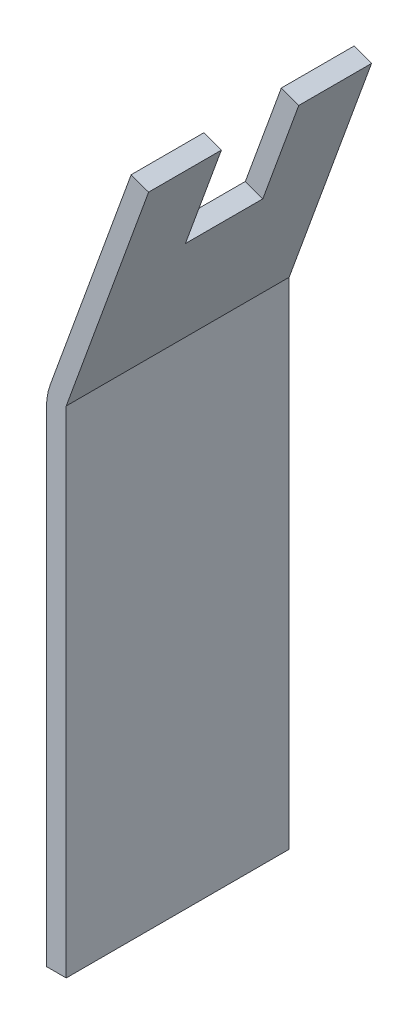
ISO-10303-21;
HEADER;
FILE_DESCRIPTION(('STEP AP214'),'2;1');
FILE_NAME('part.step','',(''),(''),'','','');
FILE_SCHEMA(('AUTOMOTIVE_DESIGN { 1 0 10303 214 1 1 1 1 }'));
ENDSEC;
DATA;
#1=APPLICATION_CONTEXT('core data for automotive mechanical design processes');
#2=APPLICATION_PROTOCOL_DEFINITION('international standard','automotive_design',2000,#1);
#3=PRODUCT_CONTEXT('',#1,'mechanical');
#4=PRODUCT('Part','Part','',(#3));
#5=PRODUCT_RELATED_PRODUCT_CATEGORY('part','',(#4));
#6=PRODUCT_DEFINITION_FORMATION('','',#4);
#7=PRODUCT_DEFINITION_CONTEXT('part definition',#1,'design');
#8=PRODUCT_DEFINITION('design','',#6,#7);
#9=PRODUCT_DEFINITION_SHAPE('','',#8);
#10=(LENGTH_UNIT() NAMED_UNIT(*) SI_UNIT(.MILLI.,.METRE.));
#11=(NAMED_UNIT(*) PLANE_ANGLE_UNIT() SI_UNIT($,.RADIAN.));
#12=(NAMED_UNIT(*) SI_UNIT($,.STERADIAN.) SOLID_ANGLE_UNIT());
#13=UNCERTAINTY_MEASURE_WITH_UNIT(LENGTH_MEASURE(1.E-05),#10,'distance_accuracy_value','');
#14=(GEOMETRIC_REPRESENTATION_CONTEXT(3) GLOBAL_UNCERTAINTY_ASSIGNED_CONTEXT((#13)) GLOBAL_UNIT_ASSIGNED_CONTEXT((#10,
#11,#12)) REPRESENTATION_CONTEXT('',''));
#15=CARTESIAN_POINT('',(0.,0.,0.));
#16=DIRECTION('',(0.,0.,1.));
#17=DIRECTION('',(1.,0.,0.));
#18=AXIS2_PLACEMENT_3D('',#15,#16,#17);
#19=CARTESIAN_POINT('',(13.6808057330267,117.587704831436,-18.));
#20=DIRECTION('',(0.342020143325668,0.939692620785909,0.));
#21=DIRECTION('',(-0.939692620785909,0.342020143325668,0.));
#22=AXIS2_PLACEMENT_3D('',#19,#20,#21);
#23=PLANE('',#22);
#24=DIRECTION('',(-0.939692620785909,0.342020143325666,0.));
#25=VECTOR('',#24,1.);
#26=CARTESIAN_POINT('',(36.3282885778676,109.34469519486,-6.25));
#27=LINE('',#26,#25);
#28=CARTESIAN_POINT('',(16.4998835953844,116.561644401459,-6.25));
#29=VERTEX_POINT('',#28);
#30=CARTESIAN_POINT('',(13.6808057330267,117.587704831436,-6.25));
#31=VERTEX_POINT('',#30);
#32=EDGE_CURVE('E149',#29,#31,#27,.T.);
#33=ORIENTED_EDGE('',*,*,#32,.F.);
#34=DIRECTION('',(0.,0.,1.));
#35=VECTOR('',#34,1.);
#36=CARTESIAN_POINT('',(16.4998835953844,116.561644401459,-18.));
#37=LINE('',#36,#35);
#38=CARTESIAN_POINT('',(16.4998835953844,116.561644401459,-18.));
#39=VERTEX_POINT('',#38);
#40=EDGE_CURVE('E138',#39,#29,#37,.T.);
#41=ORIENTED_EDGE('',*,*,#40,.F.);
#42=DIRECTION('',(-0.939692620785909,0.342020143325668,0.));
#43=VECTOR('',#42,1.);
#44=CARTESIAN_POINT('',(13.6808057330267,117.587704831436,-18.));
#45=LINE('',#44,#43);
#46=CARTESIAN_POINT('',(13.6808057330267,117.587704831436,-18.));
#47=VERTEX_POINT('',#46);
#48=EDGE_CURVE('E177',#39,#47,#45,.T.);
#49=ORIENTED_EDGE('',*,*,#48,.T.);
#50=DIRECTION('',(0.,0.,1.));
#51=VECTOR('',#50,1.);
#52=CARTESIAN_POINT('',(13.6808057330267,117.587704831436,-18.));
#53=LINE('',#52,#51);
#54=EDGE_CURVE('E190',#47,#31,#53,.T.);
#55=ORIENTED_EDGE('',*,*,#54,.T.);
#56=EDGE_LOOP('',(#33,#41,#49,#55));
#57=FACE_BOUND('',#56,.T.);
#58=ADVANCED_FACE('F35',(#57),#23,.T.);
#59=CARTESIAN_POINT('',(3.19253331742775,0.,-18.));
#60=DIRECTION('',(0.,-1.,0.));
#61=DIRECTION('',(1.,0.,0.));
#62=AXIS2_PLACEMENT_3D('',#59,#60,#61);
#63=PLANE('',#62);
#64=DIRECTION('',(0.,0.,1.));
#65=VECTOR('',#64,1.);
#66=CARTESIAN_POINT('',(3.19253331742775,0.,-18.));
#67=LINE('',#66,#65);
#68=CARTESIAN_POINT('',(3.19253331742775,0.,-18.));
#69=VERTEX_POINT('',#68);
#70=CARTESIAN_POINT('',(3.19253331742775,0.,18.));
#71=VERTEX_POINT('',#70);
#72=EDGE_CURVE('E185',#69,#71,#67,.T.);
#73=ORIENTED_EDGE('',*,*,#72,.T.);
#74=DIRECTION('',(1.,0.,0.));
#75=VECTOR('',#74,1.);
#76=CARTESIAN_POINT('',(3.19253331742775,0.,18.));
#77=LINE('',#76,#75);
#78=CARTESIAN_POINT('',(0.,0.,18.));
#79=VERTEX_POINT('',#78);
#80=EDGE_CURVE('E152',#79,#71,#77,.T.);
#81=ORIENTED_EDGE('',*,*,#80,.F.);
#82=DIRECTION('',(0.,0.,1.));
#83=VECTOR('',#82,1.);
#84=CARTESIAN_POINT('',(0.,0.,-18.));
#85=LINE('',#84,#83);
#86=CARTESIAN_POINT('',(0.,0.,-18.));
#87=VERTEX_POINT('',#86);
#88=EDGE_CURVE('E186',#87,#79,#85,.T.);
#89=ORIENTED_EDGE('',*,*,#88,.F.);
#90=DIRECTION('',(1.,0.,0.));
#91=VECTOR('',#90,1.);
#92=CARTESIAN_POINT('',(3.19253331742775,0.,-18.));
#93=LINE('',#92,#91);
#94=EDGE_CURVE('E169',#87,#69,#93,.T.);
#95=ORIENTED_EDGE('',*,*,#94,.T.);
#96=EDGE_LOOP('',(#73,#81,#89,#95));
#97=FACE_BOUND('',#96,.T.);
#98=ADVANCED_FACE('F227',(#97),#63,.T.);
#99=CARTESIAN_POINT('',(0.,0.,-18.));
#100=DIRECTION('',(-1.,0.,0.));
#101=DIRECTION('',(0.,0.,1.));
#102=AXIS2_PLACEMENT_3D('',#99,#100,#101);
#103=PLANE('',#102);
#104=DIRECTION('',(0.,-1.,0.));
#105=VECTOR('',#104,1.);
#106=CARTESIAN_POINT('',(0.,0.,18.));
#107=LINE('',#106,#105);
#108=CARTESIAN_POINT('',(0.,78.2367301929154,18.));
#109=VERTEX_POINT('',#108);
#110=EDGE_CURVE('E167',#109,#79,#107,.T.);
#111=ORIENTED_EDGE('',*,*,#110,.F.);
#112=DIRECTION('',(0.,0.,1.));
#113=VECTOR('',#112,1.);
#114=CARTESIAN_POINT('',(0.,78.2367301929154,-18.));
#115=LINE('',#114,#113);
#116=CARTESIAN_POINT('',(0.,78.2367301929154,-18.));
#117=VERTEX_POINT('',#116);
#118=EDGE_CURVE('E43',#109,#117,#115,.F.);
#119=ORIENTED_EDGE('',*,*,#118,.T.);
#120=DIRECTION('',(0.,-1.,0.));
#121=VECTOR('',#120,1.);
#122=CARTESIAN_POINT('',(0.,0.,-18.));
#123=LINE('',#122,#121);
#124=EDGE_CURVE('E183',#117,#87,#123,.T.);
#125=ORIENTED_EDGE('',*,*,#124,.T.);
#126=ORIENTED_EDGE('',*,*,#88,.T.);
#127=EDGE_LOOP('',(#111,#119,#125,#126));
#128=FACE_BOUND('',#127,.T.);
#129=ADVANCED_FACE('F207',(#128),#103,.T.);
#130=CARTESIAN_POINT('',(0.,80.,-18.));
#131=DIRECTION('',(-0.939692620785909,0.342020143325666,0.));
#132=DIRECTION('',(-0.342020143325666,-0.939692620785909,0.));
#133=AXIS2_PLACEMENT_3D('',#130,#131,#132);
#134=PLANE('',#133);
#135=DIRECTION('',(-0.342020143325666,-0.939692620785909,0.));
#136=VECTOR('',#135,1.);
#137=CARTESIAN_POINT('',(13.6808057330267,117.587704831436,-6.25));
#138=LINE('',#137,#136);
#139=CARTESIAN_POINT('',(7.86646329649034,101.612930278076,-6.25));
#140=VERTEX_POINT('',#139);
#141=EDGE_CURVE('E132',#31,#140,#138,.T.);
#142=ORIENTED_EDGE('',*,*,#141,.F.);
#143=ORIENTED_EDGE('',*,*,#54,.F.);
#144=DIRECTION('',(-0.342020143325666,-0.939692620785909,0.));
#145=VECTOR('',#144,1.);
#146=CARTESIAN_POINT('',(0.,80.,-18.));
#147=LINE('',#146,#145);
#148=CARTESIAN_POINT('',(0.603073792140909,81.656931626172,-18.));
#149=VERTEX_POINT('',#148);
#150=EDGE_CURVE('E180',#47,#149,#147,.T.);
#151=ORIENTED_EDGE('',*,*,#150,.T.);
#152=DIRECTION('',(0.,0.,1.));
#153=VECTOR('',#152,1.);
#154=CARTESIAN_POINT('',(0.603073792140909,81.656931626172,-18.));
#155=LINE('',#154,#153);
#156=CARTESIAN_POINT('',(0.603073792140909,81.656931626172,18.));
#157=VERTEX_POINT('',#156);
#158=EDGE_CURVE('E189',#149,#157,#155,.T.);
#159=ORIENTED_EDGE('',*,*,#158,.T.);
#160=DIRECTION('',(-0.342020143325666,-0.939692620785909,0.));
#161=VECTOR('',#160,1.);
#162=CARTESIAN_POINT('',(0.,80.,18.));
#163=LINE('',#162,#161);
#164=CARTESIAN_POINT('',(13.6808057330267,117.587704831436,18.));
#165=VERTEX_POINT('',#164);
#166=EDGE_CURVE('E164',#165,#157,#163,.T.);
#167=ORIENTED_EDGE('',*,*,#166,.F.);
#168=CARTESIAN_POINT('',(13.6808057330267,117.587704831436,6.25));
#169=VERTEX_POINT('',#168);
#170=EDGE_CURVE('E193',#169,#165,#53,.T.);
#171=ORIENTED_EDGE('',*,*,#170,.F.);
#172=DIRECTION('',(0.342020143325666,0.939692620785909,0.));
#173=VECTOR('',#172,1.);
#174=CARTESIAN_POINT('',(7.86646329649034,101.612930278076,6.25));
#175=LINE('',#174,#173);
#176=CARTESIAN_POINT('',(7.86646329649034,101.612930278076,6.25));
#177=VERTEX_POINT('',#176);
#178=EDGE_CURVE('E139',#177,#169,#175,.T.);
#179=ORIENTED_EDGE('',*,*,#178,.F.);
#180=DIRECTION('',(0.,0.,1.));
#181=VECTOR('',#180,1.);
#182=CARTESIAN_POINT('',(7.86646329649034,101.612930278076,-6.25));
#183=LINE('',#182,#181);
#184=EDGE_CURVE('E141',#140,#177,#183,.T.);
#185=ORIENTED_EDGE('',*,*,#184,.F.);
#186=EDGE_LOOP('',(#142,#143,#151,#159,#167,#171,#179,#185));
#187=FACE_BOUND('',#186,.T.);
#188=ADVANCED_FACE('F217',(#187),#134,.T.);
#189=DIRECTION('',(-0.939692620785909,0.342020143325666,0.));
#190=VECTOR('',#189,1.);
#191=CARTESIAN_POINT('',(36.3282885778676,109.34469519486,6.25));
#192=LINE('',#191,#190);
#193=CARTESIAN_POINT('',(16.4998835953844,116.561644401459,6.25));
#194=VERTEX_POINT('',#193);
#195=EDGE_CURVE('E50',#194,#169,#192,.T.);
#196=ORIENTED_EDGE('',*,*,#195,.T.);
#197=ORIENTED_EDGE('',*,*,#170,.T.);
#198=DIRECTION('',(-0.939692620785909,0.342020143325668,0.));
#199=VECTOR('',#198,1.);
#200=CARTESIAN_POINT('',(13.6808057330267,117.587704831436,18.));
#201=LINE('',#200,#199);
#202=CARTESIAN_POINT('',(16.4998835953844,116.561644401459,18.));
#203=VERTEX_POINT('',#202);
#204=EDGE_CURVE('E161',#203,#165,#201,.T.);
#205=ORIENTED_EDGE('',*,*,#204,.F.);
#206=EDGE_CURVE('E195',#194,#203,#37,.T.);
#207=ORIENTED_EDGE('',*,*,#206,.F.);
#208=EDGE_LOOP('',(#196,#197,#205,#207));
#209=FACE_BOUND('',#208,.T.);
#210=ADVANCED_FACE('F235',(#209),#23,.T.);
#211=CARTESIAN_POINT('',(16.4998835953844,116.561644401459,-18.));
#212=DIRECTION('',(0.939692620785909,-0.342020143325667,0.));
#213=DIRECTION('',(0.342020143325667,0.939692620785909,0.));
#214=AXIS2_PLACEMENT_3D('',#211,#212,#213);
#215=PLANE('',#214);
#216=DIRECTION('',(-0.342020143325667,-0.939692620785909,0.));
#217=VECTOR('',#216,1.);
#218=CARTESIAN_POINT('',(16.4998835953844,116.561644401459,-6.25));
#219=LINE('',#218,#217);
#220=CARTESIAN_POINT('',(10.6855411588481,100.586869848099,-6.25));
#221=VERTEX_POINT('',#220);
#222=EDGE_CURVE('E129',#29,#221,#219,.T.);
#223=ORIENTED_EDGE('',*,*,#222,.T.);
#224=DIRECTION('',(0.,0.,1.));
#225=VECTOR('',#224,1.);
#226=CARTESIAN_POINT('',(10.6855411588481,100.586869848099,-6.25));
#227=LINE('',#226,#225);
#228=CARTESIAN_POINT('',(10.6855411588481,100.586869848099,6.25));
#229=VERTEX_POINT('',#228);
#230=EDGE_CURVE('E117',#221,#229,#227,.T.);
#231=ORIENTED_EDGE('',*,*,#230,.T.);
#232=DIRECTION('',(0.342020143325667,0.939692620785909,0.));
#233=VECTOR('',#232,1.);
#234=CARTESIAN_POINT('',(10.6855411588481,100.586869848099,6.25));
#235=LINE('',#234,#233);
#236=EDGE_CURVE('E146',#229,#194,#235,.T.);
#237=ORIENTED_EDGE('',*,*,#236,.T.);
#238=ORIENTED_EDGE('',*,*,#206,.T.);
#239=DIRECTION('',(0.342020143325667,0.939692620785909,0.));
#240=VECTOR('',#239,1.);
#241=CARTESIAN_POINT('',(16.4998835953844,116.561644401459,18.));
#242=LINE('',#241,#240);
#243=CARTESIAN_POINT('',(3.19253331742773,80.,18.));
#244=VERTEX_POINT('',#243);
#245=EDGE_CURVE('E158',#244,#203,#242,.T.);
#246=ORIENTED_EDGE('',*,*,#245,.F.);
#247=DIRECTION('',(0.,0.,1.));
#248=VECTOR('',#247,1.);
#249=CARTESIAN_POINT('',(3.19253331742773,80.,-18.));
#250=LINE('',#249,#248);
#251=CARTESIAN_POINT('',(3.19253331742773,80.,-18.));
#252=VERTEX_POINT('',#251);
#253=EDGE_CURVE('E196',#252,#244,#250,.T.);
#254=ORIENTED_EDGE('',*,*,#253,.F.);
#255=DIRECTION('',(0.342020143325667,0.939692620785909,0.));
#256=VECTOR('',#255,1.);
#257=CARTESIAN_POINT('',(16.4998835953844,116.561644401459,-18.));
#258=LINE('',#257,#256);
#259=EDGE_CURVE('E175',#252,#39,#258,.T.);
#260=ORIENTED_EDGE('',*,*,#259,.T.);
#261=ORIENTED_EDGE('',*,*,#40,.T.);
#262=EDGE_LOOP('',(#223,#231,#237,#238,#246,#254,#260,#261));
#263=FACE_BOUND('',#262,.T.);
#264=ADVANCED_FACE('F136',(#263),#215,.T.);
#265=CARTESIAN_POINT('',(3.19253331742773,80.,-18.));
#266=DIRECTION('',(1.,0.,0.));
#267=DIRECTION('',(0.,1.,0.));
#268=AXIS2_PLACEMENT_3D('',#265,#266,#267);
#269=PLANE('',#268);
#270=ORIENTED_EDGE('',*,*,#253,.T.);
#271=DIRECTION('',(0.,1.,0.));
#272=VECTOR('',#271,1.);
#273=CARTESIAN_POINT('',(3.19253331742773,80.,18.));
#274=LINE('',#273,#272);
#275=EDGE_CURVE('E155',#71,#244,#274,.T.);
#276=ORIENTED_EDGE('',*,*,#275,.F.);
#277=ORIENTED_EDGE('',*,*,#72,.F.);
#278=DIRECTION('',(0.,1.,0.));
#279=VECTOR('',#278,1.);
#280=CARTESIAN_POINT('',(3.19253331742773,80.,-18.));
#281=LINE('',#280,#279);
#282=EDGE_CURVE('E172',#69,#252,#281,.T.);
#283=ORIENTED_EDGE('',*,*,#282,.T.);
#284=EDGE_LOOP('',(#270,#276,#277,#283));
#285=FACE_BOUND('',#284,.T.);
#286=ADVANCED_FACE('F224',(#285),#269,.T.);
#287=CARTESIAN_POINT('',(0.,0.,-18.));
#288=DIRECTION('',(0.,0.,-1.));
#289=DIRECTION('',(-1.,0.,0.));
#290=AXIS2_PLACEMENT_3D('',#287,#288,#289);
#291=PLANE('',#290);
#292=ORIENTED_EDGE('',*,*,#124,.F.);
#293=CARTESIAN_POINT('',(10.,78.2367301929154,-18.));
#294=DIRECTION('',(0.,0.,-1.));
#295=DIRECTION('',(-1.,0.,0.));
#296=AXIS2_PLACEMENT_3D('',#293,#294,#295);
#297=CIRCLE('',#296,10.);
#298=EDGE_CURVE('E11',#117,#149,#297,.T.);
#299=ORIENTED_EDGE('',*,*,#298,.T.);
#300=ORIENTED_EDGE('',*,*,#150,.F.);
#301=ORIENTED_EDGE('',*,*,#48,.F.);
#302=ORIENTED_EDGE('',*,*,#259,.F.);
#303=ORIENTED_EDGE('',*,*,#282,.F.);
#304=ORIENTED_EDGE('',*,*,#94,.F.);
#305=EDGE_LOOP('',(#292,#299,#300,#301,#302,#303,#304));
#306=FACE_BOUND('',#305,.T.);
#307=ADVANCED_FACE('F213',(#306),#291,.T.);
#308=CARTESIAN_POINT('',(0.,0.,18.));
#309=DIRECTION('',(0.,0.,-1.));
#310=DIRECTION('',(-1.,0.,0.));
#311=AXIS2_PLACEMENT_3D('',#308,#309,#310);
#312=PLANE('',#311);
#313=ORIENTED_EDGE('',*,*,#166,.T.);
#314=CARTESIAN_POINT('',(10.,78.2367301929154,18.));
#315=DIRECTION('',(0.,0.,-1.));
#316=DIRECTION('',(-1.,0.,0.));
#317=AXIS2_PLACEMENT_3D('',#314,#315,#316);
#318=CIRCLE('',#317,10.);
#319=EDGE_CURVE('E201',#157,#109,#318,.F.);
#320=ORIENTED_EDGE('',*,*,#319,.T.);
#321=ORIENTED_EDGE('',*,*,#110,.T.);
#322=ORIENTED_EDGE('',*,*,#80,.T.);
#323=ORIENTED_EDGE('',*,*,#275,.T.);
#324=ORIENTED_EDGE('',*,*,#245,.T.);
#325=ORIENTED_EDGE('',*,*,#204,.T.);
#326=EDGE_LOOP('',(#313,#320,#321,#322,#323,#324,#325));
#327=FACE_BOUND('',#326,.T.);
#328=ADVANCED_FACE('F203',(#327),#312,.F.);
#329=CARTESIAN_POINT('',(10.,78.2367301929154,-18.));
#330=DIRECTION('',(0.,0.,1.));
#331=DIRECTION('',(1.,0.,0.));
#332=AXIS2_PLACEMENT_3D('',#329,#330,#331);
#333=CYLINDRICAL_SURFACE('',#332,10.);
#334=ORIENTED_EDGE('',*,*,#298,.F.);
#335=ORIENTED_EDGE('',*,*,#118,.F.);
#336=ORIENTED_EDGE('',*,*,#319,.F.);
#337=ORIENTED_EDGE('',*,*,#158,.F.);
#338=EDGE_LOOP('',(#334,#335,#336,#337));
#339=FACE_BOUND('',#338,.T.);
#340=ADVANCED_FACE('F37',(#339),#333,.T.);
#341=CARTESIAN_POINT('',(36.3282885778676,109.34469519486,-6.25));
#342=DIRECTION('',(0.,0.,-1.));
#343=DIRECTION('',(-1.,0.,0.));
#344=AXIS2_PLACEMENT_3D('',#341,#342,#343);
#345=PLANE('',#344);
#346=ORIENTED_EDGE('',*,*,#32,.T.);
#347=ORIENTED_EDGE('',*,*,#141,.T.);
#348=DIRECTION('',(-0.939692620785909,0.342020143325666,0.));
#349=VECTOR('',#348,1.);
#350=CARTESIAN_POINT('',(30.5139461413312,93.3699206414995,-6.25));
#351=LINE('',#350,#349);
#352=EDGE_CURVE('E121',#221,#140,#351,.T.);
#353=ORIENTED_EDGE('',*,*,#352,.F.);
#354=ORIENTED_EDGE('',*,*,#222,.F.);
#355=EDGE_LOOP('',(#346,#347,#353,#354));
#356=FACE_BOUND('',#355,.T.);
#357=ADVANCED_FACE('F128',(#356),#345,.F.);
#358=CARTESIAN_POINT('',(30.5139461413312,93.3699206414995,-6.25));
#359=DIRECTION('',(-0.342020143325666,-0.939692620785909,0.));
#360=DIRECTION('',(0.939692620785909,-0.342020143325666,0.));
#361=AXIS2_PLACEMENT_3D('',#358,#359,#360);
#362=PLANE('',#361);
#363=ORIENTED_EDGE('',*,*,#352,.T.);
#364=ORIENTED_EDGE('',*,*,#184,.T.);
#365=DIRECTION('',(-0.939692620785909,0.342020143325666,0.));
#366=VECTOR('',#365,1.);
#367=CARTESIAN_POINT('',(30.5139461413312,93.3699206414995,6.25));
#368=LINE('',#367,#366);
#369=EDGE_CURVE('E123',#229,#177,#368,.T.);
#370=ORIENTED_EDGE('',*,*,#369,.F.);
#371=ORIENTED_EDGE('',*,*,#230,.F.);
#372=EDGE_LOOP('',(#363,#364,#370,#371));
#373=FACE_BOUND('',#372,.T.);
#374=ADVANCED_FACE('F119',(#373),#362,.F.);
#375=CARTESIAN_POINT('',(30.5139461413312,93.3699206414995,6.25));
#376=DIRECTION('',(0.,0.,1.));
#377=DIRECTION('',(1.,0.,0.));
#378=AXIS2_PLACEMENT_3D('',#375,#376,#377);
#379=PLANE('',#378);
#380=ORIENTED_EDGE('',*,*,#369,.T.);
#381=ORIENTED_EDGE('',*,*,#178,.T.);
#382=ORIENTED_EDGE('',*,*,#195,.F.);
#383=ORIENTED_EDGE('',*,*,#236,.F.);
#384=EDGE_LOOP('',(#380,#381,#382,#383));
#385=FACE_BOUND('',#384,.T.);
#386=ADVANCED_FACE('F253',(#385),#379,.F.);
#387=CLOSED_SHELL('',(#58,#98,#129,#188,#210,#264,#286,#307,#328,#340,#357,#374,#386));
#388=MANIFOLD_SOLID_BREP('B2',#387);
#389=ADVANCED_BREP_SHAPE_REPRESENTATION('',(#18,#388),#14);
#390=SHAPE_DEFINITION_REPRESENTATION(#9,#389);
ENDSEC;
END-ISO-10303-21;
